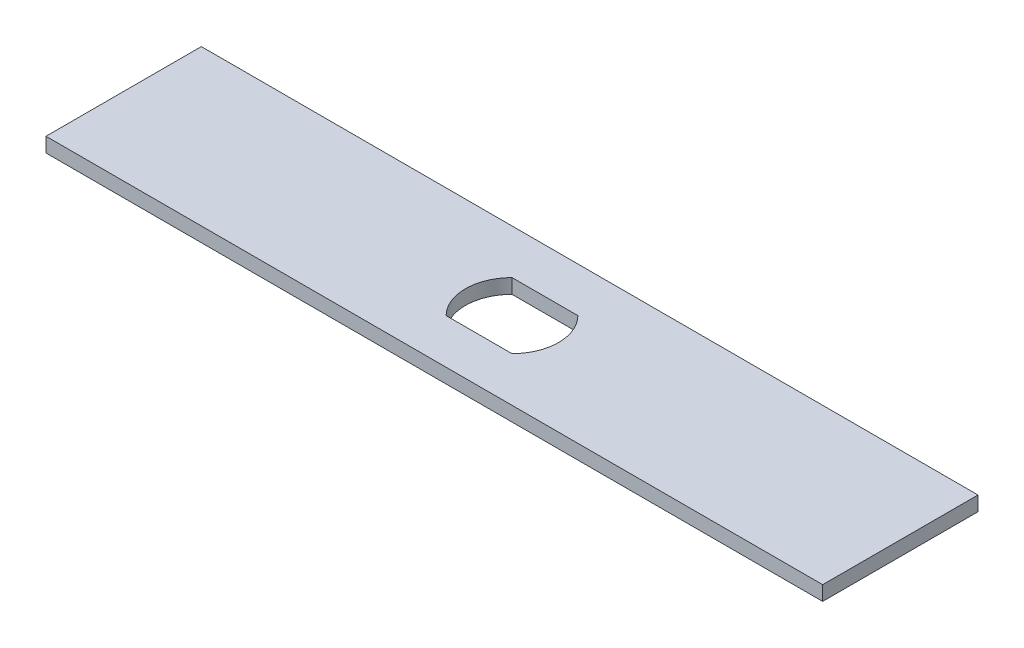
ISO-10303-21;
HEADER;
FILE_DESCRIPTION(('STEP AP214'),'2;1');
FILE_NAME('part.step','',(''),(''),'','','');
FILE_SCHEMA(('AUTOMOTIVE_DESIGN { 1 0 10303 214 1 1 1 1 }'));
ENDSEC;
DATA;
#1=APPLICATION_CONTEXT('core data for automotive mechanical design processes');
#2=APPLICATION_PROTOCOL_DEFINITION('international standard','automotive_design',2000,#1);
#3=PRODUCT_CONTEXT('',#1,'mechanical');
#4=PRODUCT('Part','Part','',(#3));
#5=PRODUCT_RELATED_PRODUCT_CATEGORY('part','',(#4));
#6=PRODUCT_DEFINITION_FORMATION('','',#4);
#7=PRODUCT_DEFINITION_CONTEXT('part definition',#1,'design');
#8=PRODUCT_DEFINITION('design','',#6,#7);
#9=PRODUCT_DEFINITION_SHAPE('','',#8);
#10=(LENGTH_UNIT() NAMED_UNIT(*) SI_UNIT(.MILLI.,.METRE.));
#11=(NAMED_UNIT(*) PLANE_ANGLE_UNIT() SI_UNIT($,.RADIAN.));
#12=(NAMED_UNIT(*) SI_UNIT($,.STERADIAN.) SOLID_ANGLE_UNIT());
#13=UNCERTAINTY_MEASURE_WITH_UNIT(LENGTH_MEASURE(1.E-05),#10,'distance_accuracy_value','');
#14=(GEOMETRIC_REPRESENTATION_CONTEXT(3) GLOBAL_UNCERTAINTY_ASSIGNED_CONTEXT((#13)) GLOBAL_UNIT_ASSIGNED_CONTEXT((#10,
#11,#12)) REPRESENTATION_CONTEXT('',''));
#15=CARTESIAN_POINT('',(0.,0.,0.));
#16=DIRECTION('',(0.,0.,1.));
#17=DIRECTION('',(1.,0.,0.));
#18=AXIS2_PLACEMENT_3D('',#15,#16,#17);
#19=CARTESIAN_POINT('',(254.,4.7498,0.));
#20=DIRECTION('',(1.,0.,0.));
#21=DIRECTION('',(0.,0.,-1.));
#22=AXIS2_PLACEMENT_3D('',#19,#20,#21);
#23=PLANE('',#22);
#24=DIRECTION('',(0.,0.,1.));
#25=VECTOR('',#24,1.);
#26=CARTESIAN_POINT('',(254.,0.,0.));
#27=LINE('',#26,#25);
#28=CARTESIAN_POINT('',(254.,0.,0.));
#29=VERTEX_POINT('',#28);
#30=CARTESIAN_POINT('',(254.,0.,50.8));
#31=VERTEX_POINT('',#30);
#32=EDGE_CURVE('E164',#29,#31,#27,.T.);
#33=ORIENTED_EDGE('',*,*,#32,.F.);
#34=DIRECTION('',(0.,-1.,0.));
#35=VECTOR('',#34,1.);
#36=CARTESIAN_POINT('',(254.,4.7498,0.));
#37=LINE('',#36,#35);
#38=CARTESIAN_POINT('',(254.,4.7498,0.));
#39=VERTEX_POINT('',#38);
#40=EDGE_CURVE('E11',#39,#29,#37,.T.);
#41=ORIENTED_EDGE('',*,*,#40,.F.);
#42=DIRECTION('',(0.,0.,1.));
#43=VECTOR('',#42,1.);
#44=CARTESIAN_POINT('',(254.,4.7498,0.));
#45=LINE('',#44,#43);
#46=CARTESIAN_POINT('',(254.,4.7498,50.8));
#47=VERTEX_POINT('',#46);
#48=EDGE_CURVE('E140',#39,#47,#45,.T.);
#49=ORIENTED_EDGE('',*,*,#48,.T.);
#50=DIRECTION('',(0.,-1.,0.));
#51=VECTOR('',#50,1.);
#52=CARTESIAN_POINT('',(254.,4.7498,50.8));
#53=LINE('',#52,#51);
#54=EDGE_CURVE('E100',#47,#31,#53,.T.);
#55=ORIENTED_EDGE('',*,*,#54,.T.);
#56=EDGE_LOOP('',(#33,#41,#49,#55));
#57=FACE_BOUND('',#56,.T.);
#58=ADVANCED_FACE('F45',(#57),#23,.T.);
#59=CARTESIAN_POINT('',(0.,4.7498,0.));
#60=DIRECTION('',(0.,0.,-1.));
#61=DIRECTION('',(-1.,0.,0.));
#62=AXIS2_PLACEMENT_3D('',#59,#60,#61);
#63=PLANE('',#62);
#64=DIRECTION('',(1.,0.,0.));
#65=VECTOR('',#64,1.);
#66=CARTESIAN_POINT('',(0.,0.,0.));
#67=LINE('',#66,#65);
#68=CARTESIAN_POINT('',(0.,0.,0.));
#69=VERTEX_POINT('',#68);
#70=EDGE_CURVE('E128',#69,#29,#67,.T.);
#71=ORIENTED_EDGE('',*,*,#70,.F.);
#72=DIRECTION('',(0.,-1.,0.));
#73=VECTOR('',#72,1.);
#74=CARTESIAN_POINT('',(0.,4.7498,0.));
#75=LINE('',#74,#73);
#76=CARTESIAN_POINT('',(0.,4.7498,0.));
#77=VERTEX_POINT('',#76);
#78=EDGE_CURVE('E56',#77,#69,#75,.T.);
#79=ORIENTED_EDGE('',*,*,#78,.F.);
#80=DIRECTION('',(1.,0.,0.));
#81=VECTOR('',#80,1.);
#82=CARTESIAN_POINT('',(0.,4.7498,0.));
#83=LINE('',#82,#81);
#84=EDGE_CURVE('E126',#77,#39,#83,.T.);
#85=ORIENTED_EDGE('',*,*,#84,.T.);
#86=ORIENTED_EDGE('',*,*,#40,.T.);
#87=EDGE_LOOP('',(#71,#79,#85,#86));
#88=FACE_BOUND('',#87,.T.);
#89=ADVANCED_FACE('F124',(#88),#63,.T.);
#90=CARTESIAN_POINT('',(0.,4.7498,0.));
#91=DIRECTION('',(1.,0.,0.));
#92=DIRECTION('',(0.,0.,-1.));
#93=AXIS2_PLACEMENT_3D('',#90,#91,#92);
#94=PLANE('',#93);
#95=DIRECTION('',(0.,0.,1.));
#96=VECTOR('',#95,1.);
#97=CARTESIAN_POINT('',(0.,0.,0.));
#98=LINE('',#97,#96);
#99=CARTESIAN_POINT('',(0.,0.,50.8));
#100=VERTEX_POINT('',#99);
#101=EDGE_CURVE('E169',#69,#100,#98,.T.);
#102=ORIENTED_EDGE('',*,*,#101,.T.);
#103=DIRECTION('',(0.,-1.,0.));
#104=VECTOR('',#103,1.);
#105=CARTESIAN_POINT('',(0.,4.7498,50.8));
#106=LINE('',#105,#104);
#107=CARTESIAN_POINT('',(0.,4.7498,50.8));
#108=VERTEX_POINT('',#107);
#109=EDGE_CURVE('E132',#108,#100,#106,.T.);
#110=ORIENTED_EDGE('',*,*,#109,.F.);
#111=DIRECTION('',(0.,0.,1.));
#112=VECTOR('',#111,1.);
#113=CARTESIAN_POINT('',(0.,4.7498,0.));
#114=LINE('',#113,#112);
#115=EDGE_CURVE('E135',#77,#108,#114,.T.);
#116=ORIENTED_EDGE('',*,*,#115,.F.);
#117=ORIENTED_EDGE('',*,*,#78,.T.);
#118=EDGE_LOOP('',(#102,#110,#116,#117));
#119=FACE_BOUND('',#118,.T.);
#120=ADVANCED_FACE('F136',(#119),#94,.F.);
#121=CARTESIAN_POINT('',(127.,4.7498,25.4));
#122=DIRECTION('',(0.,-1.,0.));
#123=DIRECTION('',(0.,0.,-1.));
#124=AXIS2_PLACEMENT_3D('',#121,#122,#123);
#125=CYLINDRICAL_SURFACE('',#124,15.24);
#126=CARTESIAN_POINT('',(127.,0.,25.4));
#127=DIRECTION('',(0.,1.,0.));
#128=DIRECTION('',(0.,0.,1.));
#129=AXIS2_PLACEMENT_3D('',#126,#127,#128);
#130=CIRCLE('',#129,15.24);
#131=CARTESIAN_POINT('',(137.776307345283,0.,36.1763073452829));
#132=VERTEX_POINT('',#131);
#133=CARTESIAN_POINT('',(137.776307345283,0.,14.6236926547171));
#134=VERTEX_POINT('',#133);
#135=EDGE_CURVE('E151',#132,#134,#130,.T.);
#136=ORIENTED_EDGE('',*,*,#135,.F.);
#137=DIRECTION('',(0.,-1.,0.));
#138=VECTOR('',#137,1.);
#139=CARTESIAN_POINT('',(137.776307345283,4.7498,36.1763073452829));
#140=LINE('',#139,#138);
#141=CARTESIAN_POINT('',(137.776307345283,4.7498,36.1763073452829));
#142=VERTEX_POINT('',#141);
#143=EDGE_CURVE('E49',#142,#132,#140,.T.);
#144=ORIENTED_EDGE('',*,*,#143,.F.);
#145=CARTESIAN_POINT('',(127.,4.7498,25.4));
#146=DIRECTION('',(0.,1.,0.));
#147=DIRECTION('',(0.,0.,1.));
#148=AXIS2_PLACEMENT_3D('',#145,#146,#147);
#149=CIRCLE('',#148,15.24);
#150=CARTESIAN_POINT('',(137.776307345283,4.7498,14.6236926547171));
#151=VERTEX_POINT('',#150);
#152=EDGE_CURVE('E174',#142,#151,#149,.T.);
#153=ORIENTED_EDGE('',*,*,#152,.T.);
#154=DIRECTION('',(0.,-1.,0.));
#155=VECTOR('',#154,1.);
#156=CARTESIAN_POINT('',(137.776307345283,4.7498,14.6236926547171));
#157=LINE('',#156,#155);
#158=EDGE_CURVE('E150',#151,#134,#157,.T.);
#159=ORIENTED_EDGE('',*,*,#158,.T.);
#160=EDGE_LOOP('',(#136,#144,#153,#159));
#161=FACE_BOUND('',#160,.T.);
#162=ADVANCED_FACE('F198',(#161),#125,.F.);
#163=CARTESIAN_POINT('',(0.,4.7498,36.1763073452829));
#164=DIRECTION('',(0.,0.,1.));
#165=DIRECTION('',(1.,0.,0.));
#166=AXIS2_PLACEMENT_3D('',#163,#164,#165);
#167=PLANE('',#166);
#168=DIRECTION('',(-1.,0.,0.));
#169=VECTOR('',#168,1.);
#170=CARTESIAN_POINT('',(0.,0.,36.1763073452829));
#171=LINE('',#170,#169);
#172=CARTESIAN_POINT('',(116.223692654717,0.,36.1763073452829));
#173=VERTEX_POINT('',#172);
#174=EDGE_CURVE('E155',#132,#173,#171,.T.);
#175=ORIENTED_EDGE('',*,*,#174,.T.);
#176=DIRECTION('',(0.,-1.,0.));
#177=VECTOR('',#176,1.);
#178=CARTESIAN_POINT('',(116.223692654717,4.7498,36.1763073452829));
#179=LINE('',#178,#177);
#180=CARTESIAN_POINT('',(116.223692654717,4.7498,36.1763073452829));
#181=VERTEX_POINT('',#180);
#182=EDGE_CURVE('E183',#181,#173,#179,.T.);
#183=ORIENTED_EDGE('',*,*,#182,.F.);
#184=DIRECTION('',(-1.,0.,0.));
#185=VECTOR('',#184,1.);
#186=CARTESIAN_POINT('',(0.,4.7498,36.1763073452829));
#187=LINE('',#186,#185);
#188=EDGE_CURVE('E193',#142,#181,#187,.T.);
#189=ORIENTED_EDGE('',*,*,#188,.F.);
#190=ORIENTED_EDGE('',*,*,#143,.T.);
#191=EDGE_LOOP('',(#175,#183,#189,#190));
#192=FACE_BOUND('',#191,.T.);
#193=ADVANCED_FACE('F47',(#192),#167,.F.);
#194=CARTESIAN_POINT('',(116.223692654717,0.,14.6236926547171));
#195=VERTEX_POINT('',#194);
#196=EDGE_CURVE('E156',#195,#173,#130,.T.);
#197=ORIENTED_EDGE('',*,*,#196,.F.);
#198=DIRECTION('',(0.,-1.,0.));
#199=VECTOR('',#198,1.);
#200=CARTESIAN_POINT('',(116.223692654717,4.7498,14.6236926547171));
#201=LINE('',#200,#199);
#202=CARTESIAN_POINT('',(116.223692654717,4.7498,14.6236926547171));
#203=VERTEX_POINT('',#202);
#204=EDGE_CURVE('E181',#203,#195,#201,.T.);
#205=ORIENTED_EDGE('',*,*,#204,.F.);
#206=EDGE_CURVE('E208',#203,#181,#149,.T.);
#207=ORIENTED_EDGE('',*,*,#206,.T.);
#208=ORIENTED_EDGE('',*,*,#182,.T.);
#209=EDGE_LOOP('',(#197,#205,#207,#208));
#210=FACE_BOUND('',#209,.T.);
#211=ADVANCED_FACE('F203',(#210),#125,.F.);
#212=CARTESIAN_POINT('',(0.,4.7498,14.6236926547171));
#213=DIRECTION('',(0.,0.,-1.));
#214=DIRECTION('',(-1.,0.,0.));
#215=AXIS2_PLACEMENT_3D('',#212,#213,#214);
#216=PLANE('',#215);
#217=DIRECTION('',(1.,0.,0.));
#218=VECTOR('',#217,1.);
#219=CARTESIAN_POINT('',(0.,0.,14.6236926547171));
#220=LINE('',#219,#218);
#221=EDGE_CURVE('E160',#195,#134,#220,.T.);
#222=ORIENTED_EDGE('',*,*,#221,.T.);
#223=ORIENTED_EDGE('',*,*,#158,.F.);
#224=DIRECTION('',(1.,0.,0.));
#225=VECTOR('',#224,1.);
#226=CARTESIAN_POINT('',(0.,4.7498,14.6236926547171));
#227=LINE('',#226,#225);
#228=EDGE_CURVE('E144',#203,#151,#227,.T.);
#229=ORIENTED_EDGE('',*,*,#228,.F.);
#230=ORIENTED_EDGE('',*,*,#204,.T.);
#231=EDGE_LOOP('',(#222,#223,#229,#230));
#232=FACE_BOUND('',#231,.T.);
#233=ADVANCED_FACE('F202',(#232),#216,.F.);
#234=CARTESIAN_POINT('',(0.,4.7498,50.8));
#235=DIRECTION('',(0.,0.,-1.));
#236=DIRECTION('',(-1.,0.,0.));
#237=AXIS2_PLACEMENT_3D('',#234,#235,#236);
#238=PLANE('',#237);
#239=DIRECTION('',(1.,0.,0.));
#240=VECTOR('',#239,1.);
#241=CARTESIAN_POINT('',(0.,0.,50.8));
#242=LINE('',#241,#240);
#243=EDGE_CURVE('E93',#100,#31,#242,.T.);
#244=ORIENTED_EDGE('',*,*,#243,.T.);
#245=ORIENTED_EDGE('',*,*,#54,.F.);
#246=DIRECTION('',(1.,0.,0.));
#247=VECTOR('',#246,1.);
#248=CARTESIAN_POINT('',(0.,4.7498,50.8));
#249=LINE('',#248,#247);
#250=EDGE_CURVE('E65',#108,#47,#249,.T.);
#251=ORIENTED_EDGE('',*,*,#250,.F.);
#252=ORIENTED_EDGE('',*,*,#109,.T.);
#253=EDGE_LOOP('',(#244,#245,#251,#252));
#254=FACE_BOUND('',#253,.T.);
#255=ADVANCED_FACE('F215',(#254),#238,.F.);
#256=CARTESIAN_POINT('',(0.,4.7498,0.));
#257=DIRECTION('',(0.,1.,0.));
#258=DIRECTION('',(0.,0.,1.));
#259=AXIS2_PLACEMENT_3D('',#256,#257,#258);
#260=PLANE('',#259);
#261=ORIENTED_EDGE('',*,*,#152,.F.);
#262=ORIENTED_EDGE('',*,*,#188,.T.);
#263=ORIENTED_EDGE('',*,*,#206,.F.);
#264=ORIENTED_EDGE('',*,*,#228,.T.);
#265=EDGE_LOOP('',(#261,#262,#263,#264));
#266=FACE_BOUND('',#265,.T.);
#267=ORIENTED_EDGE('',*,*,#48,.F.);
#268=ORIENTED_EDGE('',*,*,#84,.F.);
#269=ORIENTED_EDGE('',*,*,#115,.T.);
#270=ORIENTED_EDGE('',*,*,#250,.T.);
#271=EDGE_LOOP('',(#267,#268,#269,#270));
#272=FACE_BOUND('',#271,.T.);
#273=ADVANCED_FACE('F139',(#266,#272),#260,.T.);
#274=CARTESIAN_POINT('',(0.,0.,0.));
#275=DIRECTION('',(0.,1.,0.));
#276=DIRECTION('',(0.,0.,1.));
#277=AXIS2_PLACEMENT_3D('',#274,#275,#276);
#278=PLANE('',#277);
#279=ORIENTED_EDGE('',*,*,#135,.T.);
#280=ORIENTED_EDGE('',*,*,#221,.F.);
#281=ORIENTED_EDGE('',*,*,#196,.T.);
#282=ORIENTED_EDGE('',*,*,#174,.F.);
#283=EDGE_LOOP('',(#279,#280,#281,#282));
#284=FACE_BOUND('',#283,.T.);
#285=ORIENTED_EDGE('',*,*,#32,.T.);
#286=ORIENTED_EDGE('',*,*,#243,.F.);
#287=ORIENTED_EDGE('',*,*,#101,.F.);
#288=ORIENTED_EDGE('',*,*,#70,.T.);
#289=EDGE_LOOP('',(#285,#286,#287,#288));
#290=FACE_BOUND('',#289,.T.);
#291=ADVANCED_FACE('F196',(#284,#290),#278,.F.);
#292=CLOSED_SHELL('',(#58,#89,#120,#162,#193,#211,#233,#255,#273,#291));
#293=MANIFOLD_SOLID_BREP('B2',#292);
#294=ADVANCED_BREP_SHAPE_REPRESENTATION('',(#18,#293),#14);
#295=SHAPE_DEFINITION_REPRESENTATION(#9,#294);
ENDSEC;
END-ISO-10303-21;
